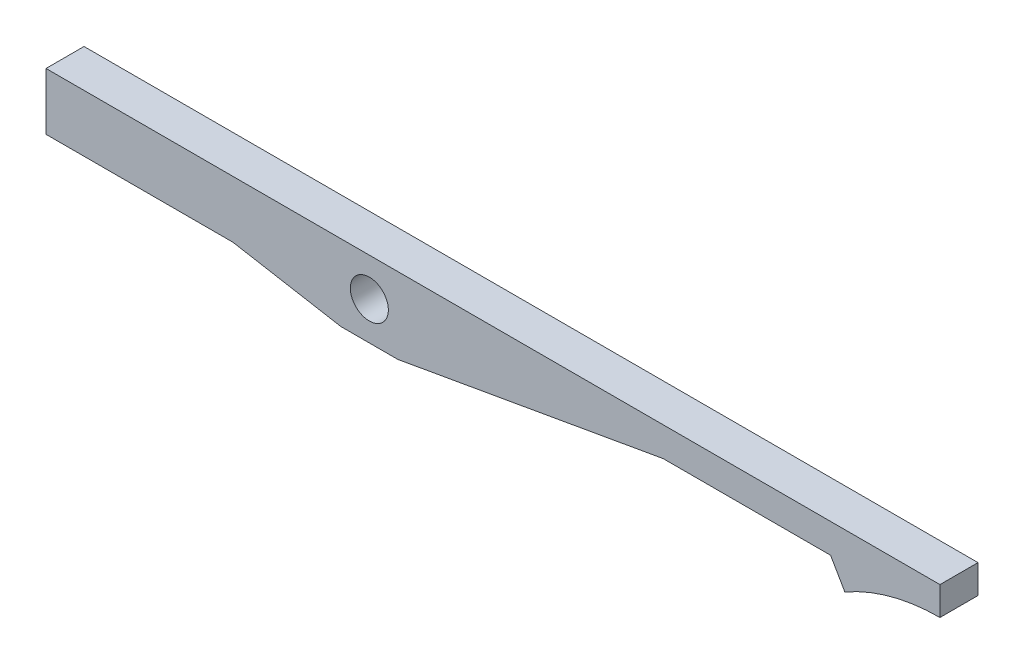
ISO-10303-21;
HEADER;
FILE_DESCRIPTION(('STEP AP214'),'2;1');
FILE_NAME('part.step','',(''),(''),'','','');
FILE_SCHEMA(('AUTOMOTIVE_DESIGN { 1 0 10303 214 1 1 1 1 }'));
ENDSEC;
DATA;
#1=APPLICATION_CONTEXT('core data for automotive mechanical design processes');
#2=APPLICATION_PROTOCOL_DEFINITION('international standard','automotive_design',2000,#1);
#3=PRODUCT_CONTEXT('',#1,'mechanical');
#4=PRODUCT('Part','Part','',(#3));
#5=PRODUCT_RELATED_PRODUCT_CATEGORY('part','',(#4));
#6=PRODUCT_DEFINITION_FORMATION('','',#4);
#7=PRODUCT_DEFINITION_CONTEXT('part definition',#1,'design');
#8=PRODUCT_DEFINITION('design','',#6,#7);
#9=PRODUCT_DEFINITION_SHAPE('','',#8);
#10=(LENGTH_UNIT() NAMED_UNIT(*) SI_UNIT(.MILLI.,.METRE.));
#11=(NAMED_UNIT(*) PLANE_ANGLE_UNIT() SI_UNIT($,.RADIAN.));
#12=(NAMED_UNIT(*) SI_UNIT($,.STERADIAN.) SOLID_ANGLE_UNIT());
#13=UNCERTAINTY_MEASURE_WITH_UNIT(LENGTH_MEASURE(1.E-05),#10,'distance_accuracy_value','');
#14=(GEOMETRIC_REPRESENTATION_CONTEXT(3) GLOBAL_UNCERTAINTY_ASSIGNED_CONTEXT((#13)) GLOBAL_UNIT_ASSIGNED_CONTEXT((#10,
#11,#12)) REPRESENTATION_CONTEXT('',''));
#15=CARTESIAN_POINT('',(0.,0.,0.));
#16=DIRECTION('',(0.,0.,1.));
#17=DIRECTION('',(1.,0.,0.));
#18=AXIS2_PLACEMENT_3D('',#15,#16,#17);
#19=CARTESIAN_POINT('',(0.,-11.5,2.));
#20=DIRECTION('',(0.,0.,1.));
#21=DIRECTION('',(1.,0.,0.));
#22=AXIS2_PLACEMENT_3D('',#19,#20,#21);
#23=PLANE('',#22);
#24=DIRECTION('',(-1.,0.,0.));
#25=VECTOR('',#24,1.);
#26=CARTESIAN_POINT('',(0.,0.,2.));
#27=LINE('',#26,#25);
#28=CARTESIAN_POINT('',(0.,0.,2.));
#29=VERTEX_POINT('',#28);
#30=CARTESIAN_POINT('',(-47.,0.,2.));
#31=VERTEX_POINT('',#30);
#32=EDGE_CURVE('E161',#29,#31,#27,.T.);
#33=ORIENTED_EDGE('',*,*,#32,.T.);
#34=DIRECTION('',(0.,-1.,0.));
#35=VECTOR('',#34,1.);
#36=CARTESIAN_POINT('',(-47.,0.,2.));
#37=LINE('',#36,#35);
#38=CARTESIAN_POINT('',(-47.,-3.00000000000001,2.));
#39=VERTEX_POINT('',#38);
#40=EDGE_CURVE('E99',#31,#39,#37,.T.);
#41=ORIENTED_EDGE('',*,*,#40,.T.);
#42=DIRECTION('',(1.,0.,0.));
#43=VECTOR('',#42,1.);
#44=CARTESIAN_POINT('',(-47.,-3.00000000000001,2.));
#45=LINE('',#44,#43);
#46=CARTESIAN_POINT('',(-37.1712818196176,-3.00000000000001,2.));
#47=VERTEX_POINT('',#46);
#48=EDGE_CURVE('E182',#39,#47,#45,.T.);
#49=ORIENTED_EDGE('',*,*,#48,.T.);
#50=DIRECTION('',(0.984807753012208,-0.173648177666931,0.));
#51=VECTOR('',#50,1.);
#52=CARTESIAN_POINT('',(-37.1712818196176,-3.00000000000001,2.));
#53=LINE('',#52,#51);
#54=CARTESIAN_POINT('',(-31.5,-4.,2.));
#55=VERTEX_POINT('',#54);
#56=EDGE_CURVE('E201',#47,#55,#53,.T.);
#57=ORIENTED_EDGE('',*,*,#56,.T.);
#58=DIRECTION('',(1.,0.,0.));
#59=VECTOR('',#58,1.);
#60=CARTESIAN_POINT('',(-31.5,-4.,2.));
#61=LINE('',#60,#59);
#62=CARTESIAN_POINT('',(-28.5,-4.,2.));
#63=VERTEX_POINT('',#62);
#64=EDGE_CURVE('E198',#55,#63,#61,.T.);
#65=ORIENTED_EDGE('',*,*,#64,.T.);
#66=DIRECTION('',(0.984807753012208,0.173648177666931,0.));
#67=VECTOR('',#66,1.);
#68=CARTESIAN_POINT('',(-14.5526611773203,-1.54070785647892,2.));
#69=LINE('',#68,#67);
#70=CARTESIAN_POINT('',(-14.5526611773203,-1.54070785647892,2.));
#71=VERTEX_POINT('',#70);
#72=EDGE_CURVE('E200',#63,#71,#69,.T.);
#73=ORIENTED_EDGE('',*,*,#72,.T.);
#74=DIRECTION('',(1.,0.,0.));
#75=VECTOR('',#74,1.);
#76=CARTESIAN_POINT('',(-5.74999999999994,-1.54070785647892,2.));
#77=LINE('',#76,#75);
#78=CARTESIAN_POINT('',(-5.74999999999994,-1.54070785647892,2.));
#79=VERTEX_POINT('',#78);
#80=EDGE_CURVE('E124',#71,#79,#77,.T.);
#81=ORIENTED_EDGE('',*,*,#80,.T.);
#82=DIRECTION('',(0.499999999999995,-0.866025403784441,0.));
#83=VECTOR('',#82,1.);
#84=CARTESIAN_POINT('',(-4.99999999999995,-2.83974596215559,2.));
#85=LINE('',#84,#83);
#86=CARTESIAN_POINT('',(-4.99999999999995,-2.83974596215559,2.));
#87=VERTEX_POINT('',#86);
#88=EDGE_CURVE('E118',#79,#87,#85,.T.);
#89=ORIENTED_EDGE('',*,*,#88,.T.);
#90=CARTESIAN_POINT('',(0.,-11.5,2.));
#91=DIRECTION('',(0.,0.,-1.));
#92=DIRECTION('',(1.,0.,0.));
#93=AXIS2_PLACEMENT_3D('',#90,#91,#92);
#94=CIRCLE('',#93,10.);
#95=CARTESIAN_POINT('',(0.,-1.5,2.));
#96=VERTEX_POINT('',#95);
#97=EDGE_CURVE('E122',#87,#96,#94,.T.);
#98=ORIENTED_EDGE('',*,*,#97,.T.);
#99=DIRECTION('',(0.,1.,0.));
#100=VECTOR('',#99,1.);
#101=CARTESIAN_POINT('',(0.,0.,2.));
#102=LINE('',#101,#100);
#103=EDGE_CURVE('E50',#96,#29,#102,.T.);
#104=ORIENTED_EDGE('',*,*,#103,.T.);
#105=EDGE_LOOP('',(#33,#41,#49,#57,#65,#73,#81,#89,#98,#104));
#106=FACE_BOUND('',#105,.T.);
#107=CARTESIAN_POINT('',(-30.,-2.,2.));
#108=DIRECTION('',(0.,0.,1.));
#109=DIRECTION('',(1.,0.,0.));
#110=AXIS2_PLACEMENT_3D('',#107,#108,#109);
#111=CIRCLE('',#110,0.999999999999998);
#112=CARTESIAN_POINT('',(-29.,-2.,2.));
#113=VERTEX_POINT('',#112);
#114=EDGE_CURVE('E146',#113,#113,#111,.T.);
#115=ORIENTED_EDGE('',*,*,#114,.F.);
#116=EDGE_LOOP('',(#115));
#117=FACE_BOUND('',#116,.T.);
#118=ADVANCED_FACE('F33',(#106,#117),#23,.T.);
#119=CARTESIAN_POINT('',(0.,-11.5,0.));
#120=DIRECTION('',(0.,0.,1.));
#121=DIRECTION('',(1.,0.,0.));
#122=AXIS2_PLACEMENT_3D('',#119,#120,#121);
#123=PLANE('',#122);
#124=DIRECTION('',(-1.,0.,0.));
#125=VECTOR('',#124,1.);
#126=CARTESIAN_POINT('',(0.,0.,0.));
#127=LINE('',#126,#125);
#128=CARTESIAN_POINT('',(0.,0.,0.));
#129=VERTEX_POINT('',#128);
#130=CARTESIAN_POINT('',(-47.,0.,0.));
#131=VERTEX_POINT('',#130);
#132=EDGE_CURVE('E142',#129,#131,#127,.T.);
#133=ORIENTED_EDGE('',*,*,#132,.F.);
#134=DIRECTION('',(0.,1.,0.));
#135=VECTOR('',#134,1.);
#136=CARTESIAN_POINT('',(0.,0.,0.));
#137=LINE('',#136,#135);
#138=CARTESIAN_POINT('',(0.,-1.5,0.));
#139=VERTEX_POINT('',#138);
#140=EDGE_CURVE('E91',#139,#129,#137,.T.);
#141=ORIENTED_EDGE('',*,*,#140,.F.);
#142=CARTESIAN_POINT('',(0.,-11.5,0.));
#143=DIRECTION('',(0.,0.,-1.));
#144=DIRECTION('',(1.,0.,0.));
#145=AXIS2_PLACEMENT_3D('',#142,#143,#144);
#146=CIRCLE('',#145,10.);
#147=CARTESIAN_POINT('',(-4.99999999999995,-2.83974596215559,0.));
#148=VERTEX_POINT('',#147);
#149=EDGE_CURVE('E85',#148,#139,#146,.T.);
#150=ORIENTED_EDGE('',*,*,#149,.F.);
#151=DIRECTION('',(0.499999999999995,-0.866025403784441,0.));
#152=VECTOR('',#151,1.);
#153=CARTESIAN_POINT('',(-4.99999999999995,-2.83974596215559,0.));
#154=LINE('',#153,#152);
#155=CARTESIAN_POINT('',(-5.74999999999994,-1.54070785647892,0.));
#156=VERTEX_POINT('',#155);
#157=EDGE_CURVE('E132',#156,#148,#154,.T.);
#158=ORIENTED_EDGE('',*,*,#157,.F.);
#159=DIRECTION('',(1.,0.,0.));
#160=VECTOR('',#159,1.);
#161=CARTESIAN_POINT('',(-5.74999999999994,-1.54070785647892,0.));
#162=LINE('',#161,#160);
#163=CARTESIAN_POINT('',(-14.5526611773203,-1.54070785647892,0.));
#164=VERTEX_POINT('',#163);
#165=EDGE_CURVE('E156',#164,#156,#162,.T.);
#166=ORIENTED_EDGE('',*,*,#165,.F.);
#167=DIRECTION('',(0.984807753012208,0.173648177666931,0.));
#168=VECTOR('',#167,1.);
#169=CARTESIAN_POINT('',(-14.5526611773203,-1.54070785647892,0.));
#170=LINE('',#169,#168);
#171=CARTESIAN_POINT('',(-28.5,-4.,0.));
#172=VERTEX_POINT('',#171);
#173=EDGE_CURVE('E154',#172,#164,#170,.T.);
#174=ORIENTED_EDGE('',*,*,#173,.F.);
#175=DIRECTION('',(1.,0.,0.));
#176=VECTOR('',#175,1.);
#177=CARTESIAN_POINT('',(-31.5,-4.,0.));
#178=LINE('',#177,#176);
#179=CARTESIAN_POINT('',(-31.5,-4.,0.));
#180=VERTEX_POINT('',#179);
#181=EDGE_CURVE('E152',#180,#172,#178,.T.);
#182=ORIENTED_EDGE('',*,*,#181,.F.);
#183=DIRECTION('',(0.984807753012208,-0.173648177666931,0.));
#184=VECTOR('',#183,1.);
#185=CARTESIAN_POINT('',(-37.1712818196176,-3.00000000000001,0.));
#186=LINE('',#185,#184);
#187=CARTESIAN_POINT('',(-37.1712818196176,-3.00000000000001,0.));
#188=VERTEX_POINT('',#187);
#189=EDGE_CURVE('E150',#188,#180,#186,.T.);
#190=ORIENTED_EDGE('',*,*,#189,.F.);
#191=DIRECTION('',(1.,0.,0.));
#192=VECTOR('',#191,1.);
#193=CARTESIAN_POINT('',(-47.,-3.00000000000001,0.));
#194=LINE('',#193,#192);
#195=CARTESIAN_POINT('',(-47.,-3.00000000000001,0.));
#196=VERTEX_POINT('',#195);
#197=EDGE_CURVE('E148',#196,#188,#194,.T.);
#198=ORIENTED_EDGE('',*,*,#197,.F.);
#199=DIRECTION('',(0.,-1.,0.));
#200=VECTOR('',#199,1.);
#201=CARTESIAN_POINT('',(-47.,0.,0.));
#202=LINE('',#201,#200);
#203=EDGE_CURVE('E145',#131,#196,#202,.T.);
#204=ORIENTED_EDGE('',*,*,#203,.F.);
#205=EDGE_LOOP('',(#133,#141,#150,#158,#166,#174,#182,#190,#198,#204));
#206=FACE_BOUND('',#205,.T.);
#207=CARTESIAN_POINT('',(-30.,-2.,0.));
#208=DIRECTION('',(0.,0.,1.));
#209=DIRECTION('',(1.,0.,0.));
#210=AXIS2_PLACEMENT_3D('',#207,#208,#209);
#211=CIRCLE('',#210,0.999999999999998);
#212=CARTESIAN_POINT('',(-29.,-2.,0.));
#213=VERTEX_POINT('',#212);
#214=EDGE_CURVE('E209',#213,#213,#211,.T.);
#215=ORIENTED_EDGE('',*,*,#214,.T.);
#216=EDGE_LOOP('',(#215));
#217=FACE_BOUND('',#216,.T.);
#218=ADVANCED_FACE('F186',(#206,#217),#123,.F.);
#219=CARTESIAN_POINT('',(0.,0.,2.));
#220=DIRECTION('',(0.,-1.,0.));
#221=DIRECTION('',(1.,0.,0.));
#222=AXIS2_PLACEMENT_3D('',#219,#220,#221);
#223=PLANE('',#222);
#224=ORIENTED_EDGE('',*,*,#132,.T.);
#225=DIRECTION('',(0.,0.,-1.));
#226=VECTOR('',#225,1.);
#227=CARTESIAN_POINT('',(-47.,0.,2.));
#228=LINE('',#227,#226);
#229=EDGE_CURVE('E11',#31,#131,#228,.T.);
#230=ORIENTED_EDGE('',*,*,#229,.F.);
#231=ORIENTED_EDGE('',*,*,#32,.F.);
#232=DIRECTION('',(0.,0.,-1.));
#233=VECTOR('',#232,1.);
#234=CARTESIAN_POINT('',(0.,0.,2.));
#235=LINE('',#234,#233);
#236=EDGE_CURVE('E138',#29,#129,#235,.T.);
#237=ORIENTED_EDGE('',*,*,#236,.T.);
#238=EDGE_LOOP('',(#224,#230,#231,#237));
#239=FACE_BOUND('',#238,.T.);
#240=ADVANCED_FACE('F35',(#239),#223,.F.);
#241=CARTESIAN_POINT('',(-47.,0.,2.));
#242=DIRECTION('',(1.,0.,0.));
#243=DIRECTION('',(0.,0.,-1.));
#244=AXIS2_PLACEMENT_3D('',#241,#242,#243);
#245=PLANE('',#244);
#246=ORIENTED_EDGE('',*,*,#203,.T.);
#247=DIRECTION('',(0.,0.,-1.));
#248=VECTOR('',#247,1.);
#249=CARTESIAN_POINT('',(-47.,-3.00000000000001,2.));
#250=LINE('',#249,#248);
#251=EDGE_CURVE('E42',#39,#196,#250,.T.);
#252=ORIENTED_EDGE('',*,*,#251,.F.);
#253=ORIENTED_EDGE('',*,*,#40,.F.);
#254=ORIENTED_EDGE('',*,*,#229,.T.);
#255=EDGE_LOOP('',(#246,#252,#253,#254));
#256=FACE_BOUND('',#255,.T.);
#257=ADVANCED_FACE('F245',(#256),#245,.F.);
#258=CARTESIAN_POINT('',(-47.,-3.00000000000001,2.));
#259=DIRECTION('',(0.,1.,0.));
#260=DIRECTION('',(0.,0.,1.));
#261=AXIS2_PLACEMENT_3D('',#258,#259,#260);
#262=PLANE('',#261);
#263=ORIENTED_EDGE('',*,*,#197,.T.);
#264=DIRECTION('',(0.,0.,-1.));
#265=VECTOR('',#264,1.);
#266=CARTESIAN_POINT('',(-37.1712818196176,-3.00000000000001,2.));
#267=LINE('',#266,#265);
#268=EDGE_CURVE('E174',#47,#188,#267,.T.);
#269=ORIENTED_EDGE('',*,*,#268,.F.);
#270=ORIENTED_EDGE('',*,*,#48,.F.);
#271=ORIENTED_EDGE('',*,*,#251,.T.);
#272=EDGE_LOOP('',(#263,#269,#270,#271));
#273=FACE_BOUND('',#272,.T.);
#274=ADVANCED_FACE('F180',(#273),#262,.F.);
#275=CARTESIAN_POINT('',(-37.1712818196176,-3.00000000000001,2.));
#276=DIRECTION('',(0.173648177666931,0.984807753012208,0.));
#277=DIRECTION('',(-0.984807753012208,0.173648177666931,0.));
#278=AXIS2_PLACEMENT_3D('',#275,#276,#277);
#279=PLANE('',#278);
#280=ORIENTED_EDGE('',*,*,#189,.T.);
#281=DIRECTION('',(0.,0.,-1.));
#282=VECTOR('',#281,1.);
#283=CARTESIAN_POINT('',(-31.5,-4.,2.));
#284=LINE('',#283,#282);
#285=EDGE_CURVE('E171',#55,#180,#284,.T.);
#286=ORIENTED_EDGE('',*,*,#285,.F.);
#287=ORIENTED_EDGE('',*,*,#56,.F.);
#288=ORIENTED_EDGE('',*,*,#268,.T.);
#289=EDGE_LOOP('',(#280,#286,#287,#288));
#290=FACE_BOUND('',#289,.T.);
#291=ADVANCED_FACE('F192',(#290),#279,.F.);
#292=CARTESIAN_POINT('',(-31.5,-4.,2.));
#293=DIRECTION('',(0.,1.,0.));
#294=DIRECTION('',(0.,0.,1.));
#295=AXIS2_PLACEMENT_3D('',#292,#293,#294);
#296=PLANE('',#295);
#297=ORIENTED_EDGE('',*,*,#181,.T.);
#298=DIRECTION('',(0.,0.,-1.));
#299=VECTOR('',#298,1.);
#300=CARTESIAN_POINT('',(-28.5,-4.,2.));
#301=LINE('',#300,#299);
#302=EDGE_CURVE('E168',#63,#172,#301,.T.);
#303=ORIENTED_EDGE('',*,*,#302,.F.);
#304=ORIENTED_EDGE('',*,*,#64,.F.);
#305=ORIENTED_EDGE('',*,*,#285,.T.);
#306=EDGE_LOOP('',(#297,#303,#304,#305));
#307=FACE_BOUND('',#306,.T.);
#308=ADVANCED_FACE('F196',(#307),#296,.F.);
#309=CARTESIAN_POINT('',(-14.5526611773203,-1.54070785647892,2.));
#310=DIRECTION('',(-0.173648177666931,0.984807753012208,0.));
#311=DIRECTION('',(-0.984807753012208,-0.173648177666931,0.));
#312=AXIS2_PLACEMENT_3D('',#309,#310,#311);
#313=PLANE('',#312);
#314=ORIENTED_EDGE('',*,*,#173,.T.);
#315=DIRECTION('',(0.,0.,-1.));
#316=VECTOR('',#315,1.);
#317=CARTESIAN_POINT('',(-14.5526611773203,-1.54070785647892,2.));
#318=LINE('',#317,#316);
#319=EDGE_CURVE('E165',#71,#164,#318,.T.);
#320=ORIENTED_EDGE('',*,*,#319,.F.);
#321=ORIENTED_EDGE('',*,*,#72,.F.);
#322=ORIENTED_EDGE('',*,*,#302,.T.);
#323=EDGE_LOOP('',(#314,#320,#321,#322));
#324=FACE_BOUND('',#323,.T.);
#325=ADVANCED_FACE('F235',(#324),#313,.F.);
#326=CARTESIAN_POINT('',(-5.74999999999994,-1.54070785647892,2.));
#327=DIRECTION('',(0.,1.,0.));
#328=DIRECTION('',(-1.,0.,0.));
#329=AXIS2_PLACEMENT_3D('',#326,#327,#328);
#330=PLANE('',#329);
#331=ORIENTED_EDGE('',*,*,#165,.T.);
#332=DIRECTION('',(0.,0.,-1.));
#333=VECTOR('',#332,1.);
#334=CARTESIAN_POINT('',(-5.74999999999994,-1.54070785647892,2.));
#335=LINE('',#334,#333);
#336=EDGE_CURVE('E133',#79,#156,#335,.T.);
#337=ORIENTED_EDGE('',*,*,#336,.F.);
#338=ORIENTED_EDGE('',*,*,#80,.F.);
#339=ORIENTED_EDGE('',*,*,#319,.T.);
#340=EDGE_LOOP('',(#331,#337,#338,#339));
#341=FACE_BOUND('',#340,.T.);
#342=ADVANCED_FACE('F232',(#341),#330,.F.);
#343=CARTESIAN_POINT('',(-4.99999999999995,-2.83974596215559,2.));
#344=DIRECTION('',(0.866025403784441,0.499999999999995,0.));
#345=DIRECTION('',(-0.499999999999995,0.866025403784442,0.));
#346=AXIS2_PLACEMENT_3D('',#343,#344,#345);
#347=PLANE('',#346);
#348=ORIENTED_EDGE('',*,*,#157,.T.);
#349=DIRECTION('',(0.,0.,-1.));
#350=VECTOR('',#349,1.);
#351=CARTESIAN_POINT('',(-4.99999999999995,-2.83974596215559,2.));
#352=LINE('',#351,#350);
#353=EDGE_CURVE('E129',#87,#148,#352,.T.);
#354=ORIENTED_EDGE('',*,*,#353,.F.);
#355=ORIENTED_EDGE('',*,*,#88,.F.);
#356=ORIENTED_EDGE('',*,*,#336,.T.);
#357=EDGE_LOOP('',(#348,#354,#355,#356));
#358=FACE_BOUND('',#357,.T.);
#359=ADVANCED_FACE('F130',(#358),#347,.F.);
#360=CARTESIAN_POINT('',(0.,-11.5,2.));
#361=DIRECTION('',(0.,0.,-1.));
#362=DIRECTION('',(-1.,0.,0.));
#363=AXIS2_PLACEMENT_3D('',#360,#361,#362);
#364=CYLINDRICAL_SURFACE('',#363,10.);
#365=ORIENTED_EDGE('',*,*,#149,.T.);
#366=DIRECTION('',(0.,0.,-1.));
#367=VECTOR('',#366,1.);
#368=CARTESIAN_POINT('',(0.,-1.5,2.));
#369=LINE('',#368,#367);
#370=EDGE_CURVE('E134',#96,#139,#369,.T.);
#371=ORIENTED_EDGE('',*,*,#370,.F.);
#372=ORIENTED_EDGE('',*,*,#97,.F.);
#373=ORIENTED_EDGE('',*,*,#353,.T.);
#374=EDGE_LOOP('',(#365,#371,#372,#373));
#375=FACE_BOUND('',#374,.T.);
#376=ADVANCED_FACE('F136',(#375),#364,.F.);
#377=CARTESIAN_POINT('',(0.,0.,2.));
#378=DIRECTION('',(-1.,0.,0.));
#379=DIRECTION('',(0.,-1.,0.));
#380=AXIS2_PLACEMENT_3D('',#377,#378,#379);
#381=PLANE('',#380);
#382=ORIENTED_EDGE('',*,*,#140,.T.);
#383=ORIENTED_EDGE('',*,*,#236,.F.);
#384=ORIENTED_EDGE('',*,*,#103,.F.);
#385=ORIENTED_EDGE('',*,*,#370,.T.);
#386=EDGE_LOOP('',(#382,#383,#384,#385));
#387=FACE_BOUND('',#386,.T.);
#388=ADVANCED_FACE('F225',(#387),#381,.F.);
#389=CARTESIAN_POINT('',(-30.,-2.,2.));
#390=DIRECTION('',(0.,0.,-1.));
#391=DIRECTION('',(-1.,0.,0.));
#392=AXIS2_PLACEMENT_3D('',#389,#390,#391);
#393=CYLINDRICAL_SURFACE('',#392,0.999999999999998);
#394=ORIENTED_EDGE('',*,*,#114,.T.);
#395=EDGE_LOOP('',(#394));
#396=FACE_BOUND('',#395,.T.);
#397=ORIENTED_EDGE('',*,*,#214,.F.);
#398=EDGE_LOOP('',(#397));
#399=FACE_BOUND('',#398,.T.);
#400=ADVANCED_FACE('F215',(#396,#399),#393,.F.);
#401=CLOSED_SHELL('',(#118,#218,#240,#257,#274,#291,#308,#325,#342,#359,#376,#388,#400));
#402=MANIFOLD_SOLID_BREP('B2',#401);
#403=ADVANCED_BREP_SHAPE_REPRESENTATION('',(#18,#402),#14);
#404=SHAPE_DEFINITION_REPRESENTATION(#9,#403);
ENDSEC;
END-ISO-10303-21;
